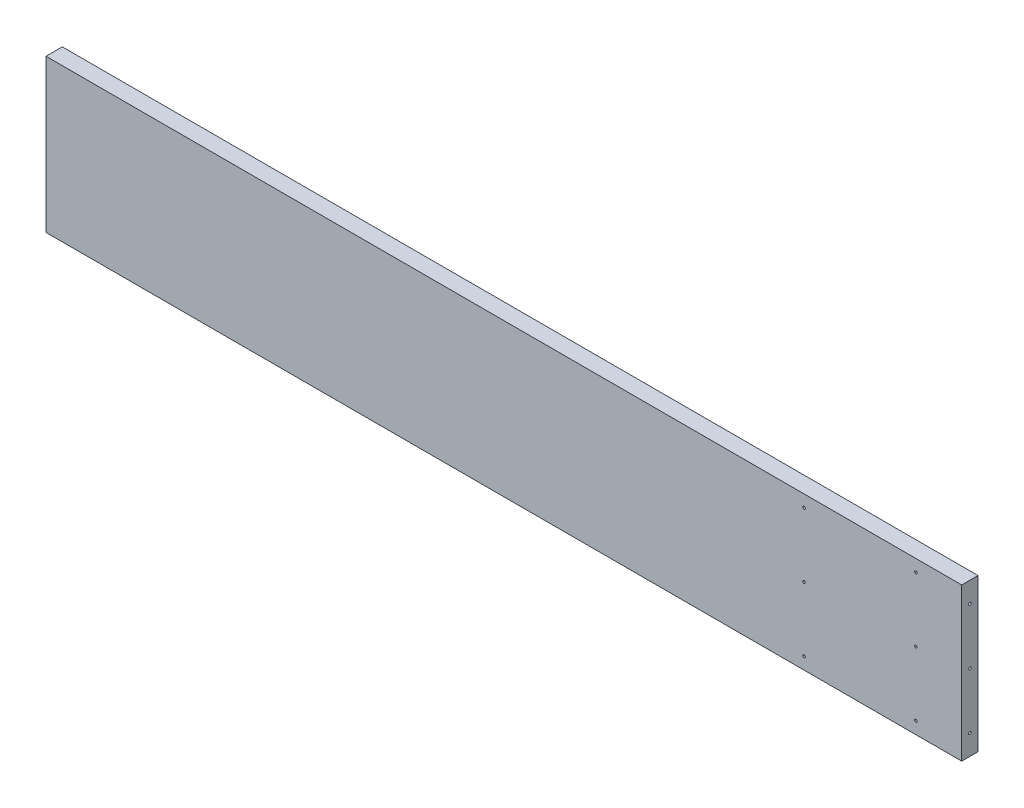
ISO-10303-21;
HEADER;
FILE_DESCRIPTION(('STEP AP214'),'2;1');
FILE_NAME('part.step','',(''),(''),'','','');
FILE_SCHEMA(('AUTOMOTIVE_DESIGN { 1 0 10303 214 1 1 1 1 }'));
ENDSEC;
DATA;
#1=APPLICATION_CONTEXT('core data for automotive mechanical design processes');
#2=APPLICATION_PROTOCOL_DEFINITION('international standard','automotive_design',2000,#1);
#3=PRODUCT_CONTEXT('',#1,'mechanical');
#4=PRODUCT('Part','Part','',(#3));
#5=PRODUCT_RELATED_PRODUCT_CATEGORY('part','',(#4));
#6=PRODUCT_DEFINITION_FORMATION('','',#4);
#7=PRODUCT_DEFINITION_CONTEXT('part definition',#1,'design');
#8=PRODUCT_DEFINITION('design','',#6,#7);
#9=PRODUCT_DEFINITION_SHAPE('','',#8);
#10=(LENGTH_UNIT() NAMED_UNIT(*) SI_UNIT(.MILLI.,.METRE.));
#11=(NAMED_UNIT(*) PLANE_ANGLE_UNIT() SI_UNIT($,.RADIAN.));
#12=(NAMED_UNIT(*) SI_UNIT($,.STERADIAN.) SOLID_ANGLE_UNIT());
#13=UNCERTAINTY_MEASURE_WITH_UNIT(LENGTH_MEASURE(1.E-05),#10,'distance_accuracy_value','');
#14=(GEOMETRIC_REPRESENTATION_CONTEXT(3) GLOBAL_UNCERTAINTY_ASSIGNED_CONTEXT((#13)) GLOBAL_UNIT_ASSIGNED_CONTEXT((#10,
#11,#12)) REPRESENTATION_CONTEXT('',''));
#15=CARTESIAN_POINT('',(0.,0.,0.));
#16=DIRECTION('',(0.,0.,1.));
#17=DIRECTION('',(1.,0.,0.));
#18=AXIS2_PLACEMENT_3D('',#15,#16,#17);
#19=CARTESIAN_POINT('',(450.,-75.,-16.));
#20=DIRECTION('',(-1.,0.,0.));
#21=DIRECTION('',(0.,0.,-1.));
#22=AXIS2_PLACEMENT_3D('',#19,#20,#21);
#23=PLANE('',#22);
#24=CARTESIAN_POINT('',(450.,55.,-8.00000000000001));
#25=DIRECTION('',(1.,0.,0.));
#26=DIRECTION('',(0.,0.,-1.));
#27=AXIS2_PLACEMENT_3D('',#24,#25,#26);
#28=CIRCLE('',#27,1.24999999999999);
#29=CARTESIAN_POINT('',(450.,55.,-9.24999999999999));
#30=VERTEX_POINT('',#29);
#31=EDGE_CURVE('E52',#30,#30,#28,.T.);
#32=ORIENTED_EDGE('',*,*,#31,.F.);
#33=EDGE_LOOP('',(#32));
#34=FACE_BOUND('',#33,.T.);
#35=CARTESIAN_POINT('',(450.,0.,-8.00000000000001));
#36=DIRECTION('',(1.,0.,0.));
#37=DIRECTION('',(0.,0.,-1.));
#38=AXIS2_PLACEMENT_3D('',#35,#36,#37);
#39=CIRCLE('',#38,1.24999999999999);
#40=CARTESIAN_POINT('',(450.,0.,-9.24999999999999));
#41=VERTEX_POINT('',#40);
#42=EDGE_CURVE('E120',#41,#41,#39,.T.);
#43=ORIENTED_EDGE('',*,*,#42,.F.);
#44=EDGE_LOOP('',(#43));
#45=FACE_BOUND('',#44,.T.);
#46=CARTESIAN_POINT('',(450.,-55.,-8.00000000000001));
#47=DIRECTION('',(1.,0.,0.));
#48=DIRECTION('',(0.,0.,-1.));
#49=AXIS2_PLACEMENT_3D('',#46,#47,#48);
#50=CIRCLE('',#49,1.24999999999999);
#51=CARTESIAN_POINT('',(450.,-55.,-9.24999999999999));
#52=VERTEX_POINT('',#51);
#53=EDGE_CURVE('E124',#52,#52,#50,.T.);
#54=ORIENTED_EDGE('',*,*,#53,.F.);
#55=EDGE_LOOP('',(#54));
#56=FACE_BOUND('',#55,.T.);
#57=DIRECTION('',(0.,1.,0.));
#58=VECTOR('',#57,1.);
#59=CARTESIAN_POINT('',(450.,-75.,0.));
#60=LINE('',#59,#58);
#61=CARTESIAN_POINT('',(450.,-75.,0.));
#62=VERTEX_POINT('',#61);
#63=CARTESIAN_POINT('',(450.,75.,0.));
#64=VERTEX_POINT('',#63);
#65=EDGE_CURVE('E149',#62,#64,#60,.T.);
#66=ORIENTED_EDGE('',*,*,#65,.F.);
#67=DIRECTION('',(0.,0.,1.));
#68=VECTOR('',#67,1.);
#69=CARTESIAN_POINT('',(450.,-75.,-16.));
#70=LINE('',#69,#68);
#71=CARTESIAN_POINT('',(450.,-75.,-16.));
#72=VERTEX_POINT('',#71);
#73=EDGE_CURVE('E162',#72,#62,#70,.T.);
#74=ORIENTED_EDGE('',*,*,#73,.F.);
#75=DIRECTION('',(0.,1.,0.));
#76=VECTOR('',#75,1.);
#77=CARTESIAN_POINT('',(450.,-75.,-16.));
#78=LINE('',#77,#76);
#79=CARTESIAN_POINT('',(450.,75.,-16.));
#80=VERTEX_POINT('',#79);
#81=EDGE_CURVE('E150',#72,#80,#78,.T.);
#82=ORIENTED_EDGE('',*,*,#81,.T.);
#83=DIRECTION('',(0.,0.,1.));
#84=VECTOR('',#83,1.);
#85=CARTESIAN_POINT('',(450.,75.,-16.));
#86=LINE('',#85,#84);
#87=EDGE_CURVE('E11',#80,#64,#86,.T.);
#88=ORIENTED_EDGE('',*,*,#87,.T.);
#89=EDGE_LOOP('',(#66,#74,#82,#88));
#90=FACE_BOUND('',#89,.T.);
#91=ADVANCED_FACE('F49',(#34,#45,#56,#90),#23,.F.);
#92=CARTESIAN_POINT('',(-450.,75.,-16.));
#93=DIRECTION('',(0.,-1.,0.));
#94=DIRECTION('',(0.,0.,1.));
#95=AXIS2_PLACEMENT_3D('',#92,#93,#94);
#96=PLANE('',#95);
#97=DIRECTION('',(-1.,0.,0.));
#98=VECTOR('',#97,1.);
#99=CARTESIAN_POINT('',(-450.,75.,0.));
#100=LINE('',#99,#98);
#101=CARTESIAN_POINT('',(-450.,75.,0.));
#102=VERTEX_POINT('',#101);
#103=EDGE_CURVE('E165',#64,#102,#100,.T.);
#104=ORIENTED_EDGE('',*,*,#103,.F.);
#105=ORIENTED_EDGE('',*,*,#87,.F.);
#106=DIRECTION('',(-1.,0.,0.));
#107=VECTOR('',#106,1.);
#108=CARTESIAN_POINT('',(-450.,75.,-16.));
#109=LINE('',#108,#107);
#110=CARTESIAN_POINT('',(-450.,75.,-16.));
#111=VERTEX_POINT('',#110);
#112=EDGE_CURVE('E94',#80,#111,#109,.T.);
#113=ORIENTED_EDGE('',*,*,#112,.T.);
#114=DIRECTION('',(0.,0.,1.));
#115=VECTOR('',#114,1.);
#116=CARTESIAN_POINT('',(-450.,75.,-16.));
#117=LINE('',#116,#115);
#118=EDGE_CURVE('E59',#111,#102,#117,.T.);
#119=ORIENTED_EDGE('',*,*,#118,.T.);
#120=EDGE_LOOP('',(#104,#105,#113,#119));
#121=FACE_BOUND('',#120,.T.);
#122=ADVANCED_FACE('F202',(#121),#96,.F.);
#123=CARTESIAN_POINT('',(-450.,-75.,-16.));
#124=DIRECTION('',(1.,0.,0.));
#125=DIRECTION('',(0.,0.,1.));
#126=AXIS2_PLACEMENT_3D('',#123,#124,#125);
#127=PLANE('',#126);
#128=DIRECTION('',(0.,-1.,0.));
#129=VECTOR('',#128,1.);
#130=CARTESIAN_POINT('',(-450.,-75.,0.));
#131=LINE('',#130,#129);
#132=CARTESIAN_POINT('',(-450.,-75.,0.));
#133=VERTEX_POINT('',#132);
#134=EDGE_CURVE('E169',#102,#133,#131,.T.);
#135=ORIENTED_EDGE('',*,*,#134,.F.);
#136=ORIENTED_EDGE('',*,*,#118,.F.);
#137=DIRECTION('',(0.,-1.,0.));
#138=VECTOR('',#137,1.);
#139=CARTESIAN_POINT('',(-450.,-75.,-16.));
#140=LINE('',#139,#138);
#141=CARTESIAN_POINT('',(-450.,-75.,-16.));
#142=VERTEX_POINT('',#141);
#143=EDGE_CURVE('E156',#111,#142,#140,.T.);
#144=ORIENTED_EDGE('',*,*,#143,.T.);
#145=DIRECTION('',(0.,0.,1.));
#146=VECTOR('',#145,1.);
#147=CARTESIAN_POINT('',(-450.,-75.,-16.));
#148=LINE('',#147,#146);
#149=EDGE_CURVE('E176',#142,#133,#148,.T.);
#150=ORIENTED_EDGE('',*,*,#149,.T.);
#151=EDGE_LOOP('',(#135,#136,#144,#150));
#152=FACE_BOUND('',#151,.T.);
#153=ADVANCED_FACE('F212',(#152),#127,.F.);
#154=CARTESIAN_POINT('',(-450.,-75.,-16.));
#155=DIRECTION('',(0.,1.,0.));
#156=DIRECTION('',(0.,0.,-1.));
#157=AXIS2_PLACEMENT_3D('',#154,#155,#156);
#158=PLANE('',#157);
#159=DIRECTION('',(1.,0.,0.));
#160=VECTOR('',#159,1.);
#161=CARTESIAN_POINT('',(-450.,-75.,0.));
#162=LINE('',#161,#160);
#163=EDGE_CURVE('E83',#133,#62,#162,.T.);
#164=ORIENTED_EDGE('',*,*,#163,.F.);
#165=ORIENTED_EDGE('',*,*,#149,.F.);
#166=DIRECTION('',(1.,0.,0.));
#167=VECTOR('',#166,1.);
#168=CARTESIAN_POINT('',(-450.,-75.,-16.));
#169=LINE('',#168,#167);
#170=EDGE_CURVE('E68',#142,#72,#169,.T.);
#171=ORIENTED_EDGE('',*,*,#170,.T.);
#172=ORIENTED_EDGE('',*,*,#73,.T.);
#173=EDGE_LOOP('',(#164,#165,#171,#172));
#174=FACE_BOUND('',#173,.T.);
#175=ADVANCED_FACE('F213',(#174),#158,.F.);
#176=CARTESIAN_POINT('',(0.,0.,-16.));
#177=DIRECTION('',(0.,0.,1.));
#178=DIRECTION('',(-1.,0.,0.));
#179=AXIS2_PLACEMENT_3D('',#176,#177,#178);
#180=PLANE('',#179);
#181=CARTESIAN_POINT('',(295.,0.,-16.));
#182=DIRECTION('',(0.,0.,-1.));
#183=DIRECTION('',(-1.,0.,0.));
#184=AXIS2_PLACEMENT_3D('',#181,#182,#183);
#185=CIRCLE('',#184,1.24999999999995);
#186=CARTESIAN_POINT('',(293.75,0.,-16.));
#187=VERTEX_POINT('',#186);
#188=EDGE_CURVE('E125',#187,#187,#185,.T.);
#189=ORIENTED_EDGE('',*,*,#188,.F.);
#190=EDGE_LOOP('',(#189));
#191=FACE_BOUND('',#190,.T.);
#192=CARTESIAN_POINT('',(405.,0.,-16.));
#193=DIRECTION('',(0.,0.,-1.));
#194=DIRECTION('',(-1.,0.,0.));
#195=AXIS2_PLACEMENT_3D('',#192,#193,#194);
#196=CIRCLE('',#195,1.24999999999995);
#197=CARTESIAN_POINT('',(403.75,0.,-16.));
#198=VERTEX_POINT('',#197);
#199=EDGE_CURVE('E130',#198,#198,#196,.T.);
#200=ORIENTED_EDGE('',*,*,#199,.F.);
#201=EDGE_LOOP('',(#200));
#202=FACE_BOUND('',#201,.T.);
#203=CARTESIAN_POINT('',(295.,63.170215564666,-16.));
#204=DIRECTION('',(0.,0.,-1.));
#205=DIRECTION('',(-1.,0.,0.));
#206=AXIS2_PLACEMENT_3D('',#203,#204,#205);
#207=CIRCLE('',#206,1.24999999999995);
#208=CARTESIAN_POINT('',(293.75,63.170215564666,-16.));
#209=VERTEX_POINT('',#208);
#210=EDGE_CURVE('E134',#209,#209,#207,.T.);
#211=ORIENTED_EDGE('',*,*,#210,.F.);
#212=EDGE_LOOP('',(#211));
#213=FACE_BOUND('',#212,.T.);
#214=CARTESIAN_POINT('',(295.,-63.1702155646659,-16.));
#215=DIRECTION('',(0.,0.,-1.));
#216=DIRECTION('',(-1.,0.,0.));
#217=AXIS2_PLACEMENT_3D('',#214,#215,#216);
#218=CIRCLE('',#217,1.24999999999995);
#219=CARTESIAN_POINT('',(293.75,-63.1702155646659,-16.));
#220=VERTEX_POINT('',#219);
#221=EDGE_CURVE('E138',#220,#220,#218,.T.);
#222=ORIENTED_EDGE('',*,*,#221,.F.);
#223=EDGE_LOOP('',(#222));
#224=FACE_BOUND('',#223,.T.);
#225=CARTESIAN_POINT('',(405.,63.170215564666,-16.));
#226=DIRECTION('',(0.,0.,-1.));
#227=DIRECTION('',(-1.,0.,0.));
#228=AXIS2_PLACEMENT_3D('',#225,#226,#227);
#229=CIRCLE('',#228,1.24999999999995);
#230=CARTESIAN_POINT('',(403.75,63.170215564666,-16.));
#231=VERTEX_POINT('',#230);
#232=EDGE_CURVE('E142',#231,#231,#229,.T.);
#233=ORIENTED_EDGE('',*,*,#232,.F.);
#234=EDGE_LOOP('',(#233));
#235=FACE_BOUND('',#234,.T.);
#236=CARTESIAN_POINT('',(405.,-63.1702155646659,-16.));
#237=DIRECTION('',(0.,0.,-1.));
#238=DIRECTION('',(-1.,0.,0.));
#239=AXIS2_PLACEMENT_3D('',#236,#237,#238);
#240=CIRCLE('',#239,1.24999999999995);
#241=CARTESIAN_POINT('',(403.75,-63.1702155646659,-16.));
#242=VERTEX_POINT('',#241);
#243=EDGE_CURVE('E146',#242,#242,#240,.T.);
#244=ORIENTED_EDGE('',*,*,#243,.F.);
#245=EDGE_LOOP('',(#244));
#246=FACE_BOUND('',#245,.T.);
#247=ORIENTED_EDGE('',*,*,#81,.F.);
#248=ORIENTED_EDGE('',*,*,#170,.F.);
#249=ORIENTED_EDGE('',*,*,#143,.F.);
#250=ORIENTED_EDGE('',*,*,#112,.F.);
#251=EDGE_LOOP('',(#247,#248,#249,#250));
#252=FACE_BOUND('',#251,.T.);
#253=ADVANCED_FACE('F215',(#191,#202,#213,#224,#235,#246,#252),#180,.F.);
#254=CARTESIAN_POINT('',(0.,0.,0.));
#255=DIRECTION('',(0.,0.,1.));
#256=DIRECTION('',(-1.,0.,0.));
#257=AXIS2_PLACEMENT_3D('',#254,#255,#256);
#258=PLANE('',#257);
#259=CARTESIAN_POINT('',(295.,0.,0.));
#260=DIRECTION('',(0.,0.,-1.));
#261=DIRECTION('',(-1.,0.,0.));
#262=AXIS2_PLACEMENT_3D('',#259,#260,#261);
#263=CIRCLE('',#262,1.24999999999995);
#264=CARTESIAN_POINT('',(293.75,0.,0.));
#265=VERTEX_POINT('',#264);
#266=EDGE_CURVE('E129',#265,#265,#263,.T.);
#267=ORIENTED_EDGE('',*,*,#266,.T.);
#268=EDGE_LOOP('',(#267));
#269=FACE_BOUND('',#268,.T.);
#270=CARTESIAN_POINT('',(405.,0.,0.));
#271=DIRECTION('',(0.,0.,-1.));
#272=DIRECTION('',(-1.,0.,0.));
#273=AXIS2_PLACEMENT_3D('',#270,#271,#272);
#274=CIRCLE('',#273,1.24999999999995);
#275=CARTESIAN_POINT('',(403.75,0.,0.));
#276=VERTEX_POINT('',#275);
#277=EDGE_CURVE('E128',#276,#276,#274,.T.);
#278=ORIENTED_EDGE('',*,*,#277,.T.);
#279=EDGE_LOOP('',(#278));
#280=FACE_BOUND('',#279,.T.);
#281=CARTESIAN_POINT('',(295.,63.170215564666,0.));
#282=DIRECTION('',(0.,0.,-1.));
#283=DIRECTION('',(-1.,0.,0.));
#284=AXIS2_PLACEMENT_3D('',#281,#282,#283);
#285=CIRCLE('',#284,1.24999999999995);
#286=CARTESIAN_POINT('',(293.75,63.170215564666,0.));
#287=VERTEX_POINT('',#286);
#288=EDGE_CURVE('E133',#287,#287,#285,.T.);
#289=ORIENTED_EDGE('',*,*,#288,.T.);
#290=EDGE_LOOP('',(#289));
#291=FACE_BOUND('',#290,.T.);
#292=CARTESIAN_POINT('',(295.,-63.1702155646659,0.));
#293=DIRECTION('',(0.,0.,-1.));
#294=DIRECTION('',(-1.,0.,0.));
#295=AXIS2_PLACEMENT_3D('',#292,#293,#294);
#296=CIRCLE('',#295,1.24999999999995);
#297=CARTESIAN_POINT('',(293.75,-63.1702155646659,0.));
#298=VERTEX_POINT('',#297);
#299=EDGE_CURVE('E137',#298,#298,#296,.T.);
#300=ORIENTED_EDGE('',*,*,#299,.T.);
#301=EDGE_LOOP('',(#300));
#302=FACE_BOUND('',#301,.T.);
#303=CARTESIAN_POINT('',(405.,63.170215564666,0.));
#304=DIRECTION('',(0.,0.,-1.));
#305=DIRECTION('',(-1.,0.,0.));
#306=AXIS2_PLACEMENT_3D('',#303,#304,#305);
#307=CIRCLE('',#306,1.24999999999995);
#308=CARTESIAN_POINT('',(403.75,63.170215564666,0.));
#309=VERTEX_POINT('',#308);
#310=EDGE_CURVE('E141',#309,#309,#307,.T.);
#311=ORIENTED_EDGE('',*,*,#310,.T.);
#312=EDGE_LOOP('',(#311));
#313=FACE_BOUND('',#312,.T.);
#314=CARTESIAN_POINT('',(405.,-63.1702155646659,0.));
#315=DIRECTION('',(0.,0.,-1.));
#316=DIRECTION('',(-1.,0.,0.));
#317=AXIS2_PLACEMENT_3D('',#314,#315,#316);
#318=CIRCLE('',#317,1.24999999999995);
#319=CARTESIAN_POINT('',(403.75,-63.1702155646659,0.));
#320=VERTEX_POINT('',#319);
#321=EDGE_CURVE('E145',#320,#320,#318,.T.);
#322=ORIENTED_EDGE('',*,*,#321,.T.);
#323=EDGE_LOOP('',(#322));
#324=FACE_BOUND('',#323,.T.);
#325=ORIENTED_EDGE('',*,*,#65,.T.);
#326=ORIENTED_EDGE('',*,*,#103,.T.);
#327=ORIENTED_EDGE('',*,*,#134,.T.);
#328=ORIENTED_EDGE('',*,*,#163,.T.);
#329=EDGE_LOOP('',(#325,#326,#327,#328));
#330=FACE_BOUND('',#329,.T.);
#331=ADVANCED_FACE('F208',(#269,#280,#291,#302,#313,#324,#330),#258,.T.);
#332=CARTESIAN_POINT('',(405.,-63.1702155646659,-32.));
#333=DIRECTION('',(0.,0.,-1.));
#334=DIRECTION('',(1.,0.,0.));
#335=AXIS2_PLACEMENT_3D('',#332,#333,#334);
#336=CYLINDRICAL_SURFACE('',#335,1.24999999999995);
#337=ORIENTED_EDGE('',*,*,#321,.F.);
#338=EDGE_LOOP('',(#337));
#339=FACE_BOUND('',#338,.T.);
#340=ORIENTED_EDGE('',*,*,#243,.T.);
#341=EDGE_LOOP('',(#340));
#342=FACE_BOUND('',#341,.T.);
#343=ADVANCED_FACE('F253',(#339,#342),#336,.F.);
#344=CARTESIAN_POINT('',(405.,63.170215564666,-32.));
#345=DIRECTION('',(0.,0.,-1.));
#346=DIRECTION('',(1.,0.,0.));
#347=AXIS2_PLACEMENT_3D('',#344,#345,#346);
#348=CYLINDRICAL_SURFACE('',#347,1.24999999999995);
#349=ORIENTED_EDGE('',*,*,#310,.F.);
#350=EDGE_LOOP('',(#349));
#351=FACE_BOUND('',#350,.T.);
#352=ORIENTED_EDGE('',*,*,#232,.T.);
#353=EDGE_LOOP('',(#352));
#354=FACE_BOUND('',#353,.T.);
#355=ADVANCED_FACE('F262',(#351,#354),#348,.F.);
#356=CARTESIAN_POINT('',(295.,-63.1702155646659,-32.));
#357=DIRECTION('',(0.,0.,-1.));
#358=DIRECTION('',(1.,0.,0.));
#359=AXIS2_PLACEMENT_3D('',#356,#357,#358);
#360=CYLINDRICAL_SURFACE('',#359,1.24999999999995);
#361=ORIENTED_EDGE('',*,*,#299,.F.);
#362=EDGE_LOOP('',(#361));
#363=FACE_BOUND('',#362,.T.);
#364=ORIENTED_EDGE('',*,*,#221,.T.);
#365=EDGE_LOOP('',(#364));
#366=FACE_BOUND('',#365,.T.);
#367=ADVANCED_FACE('F272',(#363,#366),#360,.F.);
#368=CARTESIAN_POINT('',(295.,63.170215564666,-32.));
#369=DIRECTION('',(0.,0.,-1.));
#370=DIRECTION('',(1.,0.,0.));
#371=AXIS2_PLACEMENT_3D('',#368,#369,#370);
#372=CYLINDRICAL_SURFACE('',#371,1.24999999999995);
#373=ORIENTED_EDGE('',*,*,#288,.F.);
#374=EDGE_LOOP('',(#373));
#375=FACE_BOUND('',#374,.T.);
#376=ORIENTED_EDGE('',*,*,#210,.T.);
#377=EDGE_LOOP('',(#376));
#378=FACE_BOUND('',#377,.T.);
#379=ADVANCED_FACE('F282',(#375,#378),#372,.F.);
#380=CARTESIAN_POINT('',(405.,0.,-32.));
#381=DIRECTION('',(0.,0.,-1.));
#382=DIRECTION('',(1.,0.,0.));
#383=AXIS2_PLACEMENT_3D('',#380,#381,#382);
#384=CYLINDRICAL_SURFACE('',#383,1.24999999999995);
#385=ORIENTED_EDGE('',*,*,#277,.F.);
#386=EDGE_LOOP('',(#385));
#387=FACE_BOUND('',#386,.T.);
#388=ORIENTED_EDGE('',*,*,#199,.T.);
#389=EDGE_LOOP('',(#388));
#390=FACE_BOUND('',#389,.T.);
#391=ADVANCED_FACE('F292',(#387,#390),#384,.F.);
#392=CARTESIAN_POINT('',(295.,0.,-32.));
#393=DIRECTION('',(0.,0.,-1.));
#394=DIRECTION('',(1.,0.,0.));
#395=AXIS2_PLACEMENT_3D('',#392,#393,#394);
#396=CYLINDRICAL_SURFACE('',#395,1.24999999999995);
#397=ORIENTED_EDGE('',*,*,#266,.F.);
#398=EDGE_LOOP('',(#397));
#399=FACE_BOUND('',#398,.T.);
#400=ORIENTED_EDGE('',*,*,#188,.T.);
#401=EDGE_LOOP('',(#400));
#402=FACE_BOUND('',#401,.T.);
#403=ADVANCED_FACE('F302',(#399,#402),#396,.F.);
#404=CARTESIAN_POINT('',(468.,-55.,-8.00000000000001));
#405=DIRECTION('',(1.,0.,0.));
#406=DIRECTION('',(0.,0.,1.));
#407=AXIS2_PLACEMENT_3D('',#404,#405,#406);
#408=CYLINDRICAL_SURFACE('',#407,1.24999999999999);
#409=CARTESIAN_POINT('',(428.,-55.,-8.00000000000001));
#410=DIRECTION('',(-1.,0.,0.));
#411=DIRECTION('',(0.,0.,1.));
#412=AXIS2_PLACEMENT_3D('',#409,#410,#411);
#413=CIRCLE('',#412,1.24999999999999);
#414=CARTESIAN_POINT('',(428.,-55.,-6.75000000000002));
#415=VERTEX_POINT('',#414);
#416=EDGE_CURVE('E121',#415,#415,#413,.T.);
#417=ORIENTED_EDGE('',*,*,#416,.T.);
#418=EDGE_LOOP('',(#417));
#419=FACE_BOUND('',#418,.T.);
#420=ORIENTED_EDGE('',*,*,#53,.T.);
#421=EDGE_LOOP('',(#420));
#422=FACE_BOUND('',#421,.T.);
#423=ADVANCED_FACE('F312',(#419,#422),#408,.F.);
#424=CARTESIAN_POINT('',(428.,-55.,-8.00000000000001));
#425=DIRECTION('',(1.,0.,0.));
#426=DIRECTION('',(0.,0.,1.));
#427=AXIS2_PLACEMENT_3D('',#424,#425,#426);
#428=CONICAL_SURFACE('',#427,1.24999999999999,1.02974425867664);
#429=CARTESIAN_POINT('',(427.248924226215,-55.,-8.00000000000001));
#430=VERTEX_POINT('',#429);
#431=VERTEX_LOOP('',#430);
#432=FACE_BOUND('',#431,.T.);
#433=ORIENTED_EDGE('',*,*,#416,.F.);
#434=EDGE_LOOP('',(#433));
#435=FACE_BOUND('',#434,.T.);
#436=ADVANCED_FACE('F322',(#432,#435),#428,.F.);
#437=CARTESIAN_POINT('',(468.,0.,-8.00000000000001));
#438=DIRECTION('',(1.,0.,0.));
#439=DIRECTION('',(0.,0.,1.));
#440=AXIS2_PLACEMENT_3D('',#437,#438,#439);
#441=CYLINDRICAL_SURFACE('',#440,1.24999999999999);
#442=CARTESIAN_POINT('',(428.,0.,-8.00000000000001));
#443=DIRECTION('',(-1.,0.,0.));
#444=DIRECTION('',(0.,0.,1.));
#445=AXIS2_PLACEMENT_3D('',#442,#443,#444);
#446=CIRCLE('',#445,1.24999999999998);
#447=CARTESIAN_POINT('',(428.,0.,-6.75000000000002));
#448=VERTEX_POINT('',#447);
#449=EDGE_CURVE('E116',#448,#448,#446,.T.);
#450=ORIENTED_EDGE('',*,*,#449,.T.);
#451=EDGE_LOOP('',(#450));
#452=FACE_BOUND('',#451,.T.);
#453=ORIENTED_EDGE('',*,*,#42,.T.);
#454=EDGE_LOOP('',(#453));
#455=FACE_BOUND('',#454,.T.);
#456=ADVANCED_FACE('F198',(#452,#455),#441,.F.);
#457=CARTESIAN_POINT('',(428.,0.,-8.00000000000001));
#458=DIRECTION('',(1.,0.,0.));
#459=DIRECTION('',(0.,0.,1.));
#460=AXIS2_PLACEMENT_3D('',#457,#458,#459);
#461=CONICAL_SURFACE('',#460,1.24999999999998,1.02974425867663);
#462=CARTESIAN_POINT('',(427.248924226215,0.,-8.00000000000001));
#463=VERTEX_POINT('',#462);
#464=VERTEX_LOOP('',#463);
#465=FACE_BOUND('',#464,.T.);
#466=ORIENTED_EDGE('',*,*,#449,.F.);
#467=EDGE_LOOP('',(#466));
#468=FACE_BOUND('',#467,.T.);
#469=ADVANCED_FACE('F341',(#465,#468),#461,.F.);
#470=CARTESIAN_POINT('',(468.,55.,-8.00000000000001));
#471=DIRECTION('',(1.,0.,0.));
#472=DIRECTION('',(0.,0.,1.));
#473=AXIS2_PLACEMENT_3D('',#470,#471,#472);
#474=CYLINDRICAL_SURFACE('',#473,1.24999999999999);
#475=CARTESIAN_POINT('',(428.,55.,-8.00000000000001));
#476=DIRECTION('',(-1.,0.,0.));
#477=DIRECTION('',(0.,0.,1.));
#478=AXIS2_PLACEMENT_3D('',#475,#476,#477);
#479=CIRCLE('',#478,1.24999999999999);
#480=CARTESIAN_POINT('',(428.,55.,-6.75000000000002));
#481=VERTEX_POINT('',#480);
#482=EDGE_CURVE('E112',#481,#481,#479,.T.);
#483=ORIENTED_EDGE('',*,*,#482,.T.);
#484=EDGE_LOOP('',(#483));
#485=FACE_BOUND('',#484,.T.);
#486=ORIENTED_EDGE('',*,*,#31,.T.);
#487=EDGE_LOOP('',(#486));
#488=FACE_BOUND('',#487,.T.);
#489=ADVANCED_FACE('F108',(#485,#488),#474,.F.);
#490=CARTESIAN_POINT('',(428.,55.,-8.00000000000001));
#491=DIRECTION('',(1.,0.,0.));
#492=DIRECTION('',(0.,0.,1.));
#493=AXIS2_PLACEMENT_3D('',#490,#491,#492);
#494=CONICAL_SURFACE('',#493,1.24999999999999,1.02974425867664);
#495=CARTESIAN_POINT('',(427.248924226215,55.,-8.00000000000001));
#496=VERTEX_POINT('',#495);
#497=VERTEX_LOOP('',#496);
#498=FACE_BOUND('',#497,.T.);
#499=ORIENTED_EDGE('',*,*,#482,.F.);
#500=EDGE_LOOP('',(#499));
#501=FACE_BOUND('',#500,.T.);
#502=ADVANCED_FACE('F105',(#498,#501),#494,.F.);
#503=CLOSED_SHELL('',(#91,#122,#153,#175,#253,#331,#343,#355,#367,#379,#391,#403,#423,#436,#456,
#469,#489,#502));
#504=MANIFOLD_SOLID_BREP('B2',#503);
#505=ADVANCED_BREP_SHAPE_REPRESENTATION('',(#18,#504),#14);
#506=SHAPE_DEFINITION_REPRESENTATION(#9,#505);
ENDSEC;
END-ISO-10303-21;
